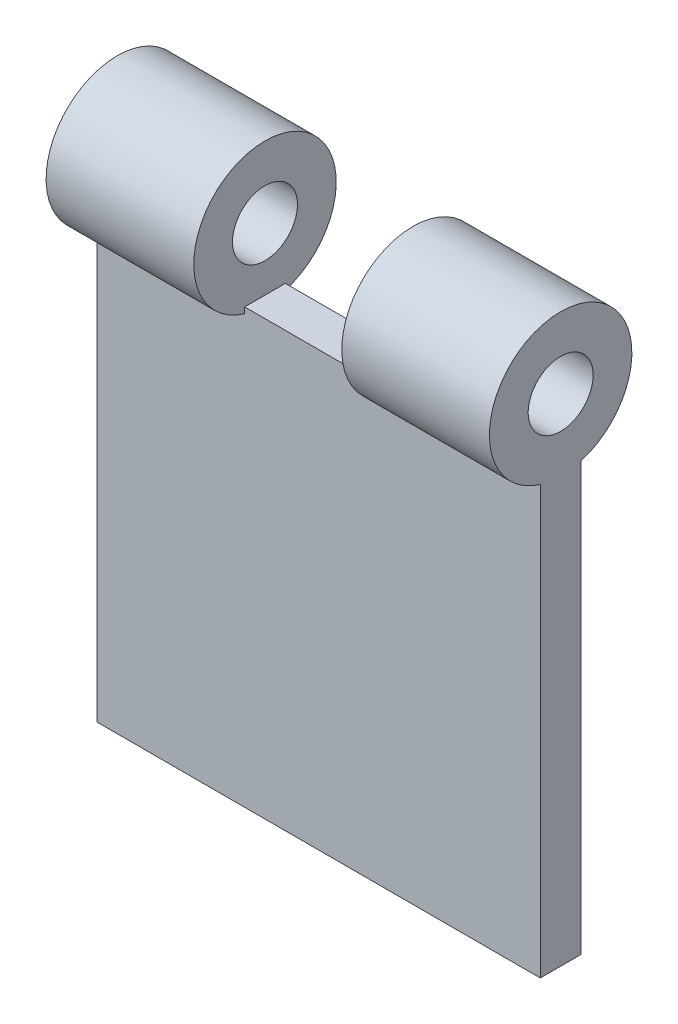
ISO-10303-21;
HEADER;
FILE_DESCRIPTION(('STEP AP214'),'2;1');
FILE_NAME('part.step','',(''),(''),'','','');
FILE_SCHEMA(('AUTOMOTIVE_DESIGN { 1 0 10303 214 1 1 1 1 }'));
ENDSEC;
DATA;
#1=APPLICATION_CONTEXT('core data for automotive mechanical design processes');
#2=APPLICATION_PROTOCOL_DEFINITION('international standard','automotive_design',2000,#1);
#3=PRODUCT_CONTEXT('',#1,'mechanical');
#4=PRODUCT('Part','Part','',(#3));
#5=PRODUCT_RELATED_PRODUCT_CATEGORY('part','',(#4));
#6=PRODUCT_DEFINITION_FORMATION('','',#4);
#7=PRODUCT_DEFINITION_CONTEXT('part definition',#1,'design');
#8=PRODUCT_DEFINITION('design','',#6,#7);
#9=PRODUCT_DEFINITION_SHAPE('','',#8);
#10=(LENGTH_UNIT() NAMED_UNIT(*) SI_UNIT(.MILLI.,.METRE.));
#11=(NAMED_UNIT(*) PLANE_ANGLE_UNIT() SI_UNIT($,.RADIAN.));
#12=(NAMED_UNIT(*) SI_UNIT($,.STERADIAN.) SOLID_ANGLE_UNIT());
#13=UNCERTAINTY_MEASURE_WITH_UNIT(LENGTH_MEASURE(1.E-05),#10,'distance_accuracy_value','');
#14=(GEOMETRIC_REPRESENTATION_CONTEXT(3) GLOBAL_UNCERTAINTY_ASSIGNED_CONTEXT((#13)) GLOBAL_UNIT_ASSIGNED_CONTEXT((#10,
#11,#12)) REPRESENTATION_CONTEXT('',''));
#15=CARTESIAN_POINT('',(0.,0.,0.));
#16=DIRECTION('',(0.,0.,1.));
#17=DIRECTION('',(1.,0.,0.));
#18=AXIS2_PLACEMENT_3D('',#15,#16,#17);
#19=CARTESIAN_POINT('',(-7.67596875,11.09378125,1.143));
#20=DIRECTION('',(1.,0.,0.));
#21=DIRECTION('',(0.,1.,0.));
#22=AXIS2_PLACEMENT_3D('',#19,#20,#21);
#23=CYLINDRICAL_SURFACE('',#22,4.);
#24=DIRECTION('',(-1.,0.,0.));
#25=VECTOR('',#24,1.);
#26=CARTESIAN_POINT('',(24.7226561796803,7.26056445467,2.286));
#27=LINE('',#26,#25);
#28=CARTESIAN_POINT('',(0.614031250000001,7.26056445467,2.286));
#29=VERTEX_POINT('',#28);
#30=CARTESIAN_POINT('',(-7.67596875,7.26056445467,2.28600000000001));
#31=VERTEX_POINT('',#30);
#32=EDGE_CURVE('E148',#29,#31,#27,.T.);
#33=ORIENTED_EDGE('',*,*,#32,.F.);
#34=CARTESIAN_POINT('',(0.614031249999999,11.09378125,1.143));
#35=DIRECTION('',(1.,0.,0.));
#36=DIRECTION('',(0.,1.,0.));
#37=AXIS2_PLACEMENT_3D('',#34,#35,#36);
#38=CIRCLE('',#37,4.);
#39=CARTESIAN_POINT('',(0.614031250000001,7.26056445467,0.));
#40=VERTEX_POINT('',#39);
#41=EDGE_CURVE('E38',#40,#29,#38,.T.);
#42=ORIENTED_EDGE('',*,*,#41,.F.);
#43=DIRECTION('',(-1.,0.,0.));
#44=VECTOR('',#43,1.);
#45=CARTESIAN_POINT('',(24.7226561796803,7.26056445467,0.));
#46=LINE('',#45,#44);
#47=CARTESIAN_POINT('',(-7.67596874999999,7.26056445467,0.));
#48=VERTEX_POINT('',#47);
#49=EDGE_CURVE('E145',#40,#48,#46,.T.);
#50=ORIENTED_EDGE('',*,*,#49,.T.);
#51=CARTESIAN_POINT('',(-7.67596875,11.09378125,1.143));
#52=DIRECTION('',(1.,0.,0.));
#53=DIRECTION('',(0.,1.,0.));
#54=AXIS2_PLACEMENT_3D('',#51,#52,#53);
#55=CIRCLE('',#54,4.);
#56=EDGE_CURVE('E11',#48,#31,#55,.T.);
#57=ORIENTED_EDGE('',*,*,#56,.T.);
#58=EDGE_LOOP('',(#33,#42,#50,#57));
#59=FACE_BOUND('',#58,.T.);
#60=ADVANCED_FACE('F35',(#59),#23,.T.);
#61=CARTESIAN_POINT('',(-7.67596875,11.09378125,1.143));
#62=DIRECTION('',(1.,0.,0.));
#63=DIRECTION('',(0.,1.,0.));
#64=AXIS2_PLACEMENT_3D('',#61,#62,#63);
#65=PLANE('',#64);
#66=CARTESIAN_POINT('',(-7.67596875,11.09378125,1.143));
#67=DIRECTION('',(1.,0.,0.));
#68=DIRECTION('',(0.,1.,0.));
#69=AXIS2_PLACEMENT_3D('',#66,#67,#68);
#70=CIRCLE('',#69,1.825);
#71=CARTESIAN_POINT('',(-7.67596875,12.91878125,1.143));
#72=VERTEX_POINT('',#71);
#73=EDGE_CURVE('E156',#72,#72,#70,.T.);
#74=ORIENTED_EDGE('',*,*,#73,.T.);
#75=EDGE_LOOP('',(#74));
#76=FACE_BOUND('',#75,.T.);
#77=DIRECTION('',(0.,0.,1.));
#78=VECTOR('',#77,1.);
#79=CARTESIAN_POINT('',(-7.67596875,7.59378125,1.143));
#80=LINE('',#79,#78);
#81=CARTESIAN_POINT('',(-7.67596875,7.59378125,0.));
#82=VERTEX_POINT('',#81);
#83=CARTESIAN_POINT('',(-7.67596875,7.59378125,2.286));
#84=VERTEX_POINT('',#83);
#85=EDGE_CURVE('E49',#82,#84,#80,.T.);
#86=ORIENTED_EDGE('',*,*,#85,.T.);
#87=DIRECTION('',(0.,-1.,0.));
#88=VECTOR('',#87,1.);
#89=CARTESIAN_POINT('',(-7.67596875,11.09378125,2.286));
#90=LINE('',#89,#88);
#91=EDGE_CURVE('E128',#84,#31,#90,.T.);
#92=ORIENTED_EDGE('',*,*,#91,.T.);
#93=ORIENTED_EDGE('',*,*,#56,.F.);
#94=DIRECTION('',(0.,-1.,0.));
#95=VECTOR('',#94,1.);
#96=CARTESIAN_POINT('',(-7.67596875,11.09378125,0.));
#97=LINE('',#96,#95);
#98=EDGE_CURVE('E54',#82,#48,#97,.T.);
#99=ORIENTED_EDGE('',*,*,#98,.F.);
#100=EDGE_LOOP('',(#86,#92,#93,#99));
#101=FACE_BOUND('',#100,.T.);
#102=ADVANCED_FACE('F166',(#76,#101),#65,.F.);
#103=CARTESIAN_POINT('',(0.614031249999999,11.09378125,1.143));
#104=DIRECTION('',(1.,0.,0.));
#105=DIRECTION('',(0.,1.,0.));
#106=AXIS2_PLACEMENT_3D('',#103,#104,#105);
#107=PLANE('',#106);
#108=ORIENTED_EDGE('',*,*,#41,.T.);
#109=DIRECTION('',(0.,1.,0.));
#110=VECTOR('',#109,1.);
#111=CARTESIAN_POINT('',(0.614031250000001,7.26056445467,2.286));
#112=LINE('',#111,#110);
#113=CARTESIAN_POINT('',(0.614031250000011,-16.73943554533,2.286));
#114=VERTEX_POINT('',#113);
#115=EDGE_CURVE('E146',#114,#29,#112,.T.);
#116=ORIENTED_EDGE('',*,*,#115,.F.);
#117=DIRECTION('',(0.,0.,1.));
#118=VECTOR('',#117,1.);
#119=CARTESIAN_POINT('',(0.614031250000004,-16.73943554533,0.));
#120=LINE('',#119,#118);
#121=CARTESIAN_POINT('',(0.614031250000004,-16.73943554533,0.));
#122=VERTEX_POINT('',#121);
#123=EDGE_CURVE('E134',#122,#114,#120,.T.);
#124=ORIENTED_EDGE('',*,*,#123,.F.);
#125=DIRECTION('',(0.,-1.,0.));
#126=VECTOR('',#125,1.);
#127=CARTESIAN_POINT('',(0.614031250000001,7.26056445467,0.));
#128=LINE('',#127,#126);
#129=EDGE_CURVE('E142',#40,#122,#128,.T.);
#130=ORIENTED_EDGE('',*,*,#129,.F.);
#131=EDGE_LOOP('',(#108,#116,#124,#130));
#132=FACE_BOUND('',#131,.T.);
#133=CARTESIAN_POINT('',(0.614031249999999,11.09378125,1.143));
#134=DIRECTION('',(1.,0.,0.));
#135=DIRECTION('',(0.,1.,0.));
#136=AXIS2_PLACEMENT_3D('',#133,#134,#135);
#137=CIRCLE('',#136,1.825);
#138=CARTESIAN_POINT('',(0.614031249999999,12.91878125,1.143));
#139=VERTEX_POINT('',#138);
#140=EDGE_CURVE('E155',#139,#139,#137,.T.);
#141=ORIENTED_EDGE('',*,*,#140,.F.);
#142=EDGE_LOOP('',(#141));
#143=FACE_BOUND('',#142,.T.);
#144=ADVANCED_FACE('F164',(#132,#143),#107,.T.);
#145=CARTESIAN_POINT('',(-7.67596875,11.09378125,1.143));
#146=DIRECTION('',(1.,0.,0.));
#147=DIRECTION('',(0.,1.,0.));
#148=AXIS2_PLACEMENT_3D('',#145,#146,#147);
#149=CYLINDRICAL_SURFACE('',#148,1.825);
#150=ORIENTED_EDGE('',*,*,#73,.F.);
#151=EDGE_LOOP('',(#150));
#152=FACE_BOUND('',#151,.T.);
#153=ORIENTED_EDGE('',*,*,#140,.T.);
#154=EDGE_LOOP('',(#153));
#155=FACE_BOUND('',#154,.T.);
#156=ADVANCED_FACE('F162',(#152,#155),#149,.F.);
#157=CARTESIAN_POINT('',(-24.27796875,0.,0.));
#158=DIRECTION('',(-1.,0.,0.));
#159=DIRECTION('',(0.,0.,1.));
#160=AXIS2_PLACEMENT_3D('',#157,#158,#159);
#161=PLANE('',#160);
#162=DIRECTION('',(0.,-1.,0.));
#163=VECTOR('',#162,1.);
#164=CARTESIAN_POINT('',(-24.27796875,7.26056445467,0.));
#165=LINE('',#164,#163);
#166=CARTESIAN_POINT('',(-24.27796875,7.26056445467,0.));
#167=VERTEX_POINT('',#166);
#168=CARTESIAN_POINT('',(-24.27796875,-16.73943554533,0.));
#169=VERTEX_POINT('',#168);
#170=EDGE_CURVE('E131',#167,#169,#165,.T.);
#171=ORIENTED_EDGE('',*,*,#170,.T.);
#172=DIRECTION('',(0.,0.,1.));
#173=VECTOR('',#172,1.);
#174=CARTESIAN_POINT('',(-24.27796875,-16.73943554533,0.));
#175=LINE('',#174,#173);
#176=CARTESIAN_POINT('',(-24.27796875,-16.73943554533,2.286));
#177=VERTEX_POINT('',#176);
#178=EDGE_CURVE('E135',#169,#177,#175,.T.);
#179=ORIENTED_EDGE('',*,*,#178,.T.);
#180=DIRECTION('',(0.,1.,0.));
#181=VECTOR('',#180,1.);
#182=CARTESIAN_POINT('',(-24.27796875,7.26056445467,2.286));
#183=LINE('',#182,#181);
#184=CARTESIAN_POINT('',(-24.27796875,7.26056445467,2.286));
#185=VERTEX_POINT('',#184);
#186=EDGE_CURVE('E132',#177,#185,#183,.T.);
#187=ORIENTED_EDGE('',*,*,#186,.T.);
#188=CARTESIAN_POINT('',(-24.27796875,11.09378125,1.143));
#189=DIRECTION('',(-1.,0.,0.));
#190=DIRECTION('',(0.,0.,1.));
#191=AXIS2_PLACEMENT_3D('',#188,#189,#190);
#192=CIRCLE('',#191,4.);
#193=EDGE_CURVE('E195',#185,#167,#192,.T.);
#194=ORIENTED_EDGE('',*,*,#193,.T.);
#195=EDGE_LOOP('',(#171,#179,#187,#194));
#196=FACE_BOUND('',#195,.T.);
#197=CARTESIAN_POINT('',(-24.27796875,11.09378125,1.143));
#198=DIRECTION('',(-1.,0.,0.));
#199=DIRECTION('',(0.,0.,1.));
#200=AXIS2_PLACEMENT_3D('',#197,#198,#199);
#201=CIRCLE('',#200,1.825);
#202=CARTESIAN_POINT('',(-24.27796875,11.09378125,2.968));
#203=VERTEX_POINT('',#202);
#204=EDGE_CURVE('E200',#203,#203,#201,.T.);
#205=ORIENTED_EDGE('',*,*,#204,.F.);
#206=EDGE_LOOP('',(#205));
#207=FACE_BOUND('',#206,.T.);
#208=ADVANCED_FACE('F172',(#196,#207),#161,.T.);
#209=CARTESIAN_POINT('',(24.7226561796803,-16.73943554533,0.));
#210=DIRECTION('',(0.,-1.,0.));
#211=DIRECTION('',(0.,0.,-1.));
#212=AXIS2_PLACEMENT_3D('',#209,#210,#211);
#213=PLANE('',#212);
#214=DIRECTION('',(-1.,0.,0.));
#215=VECTOR('',#214,1.);
#216=CARTESIAN_POINT('',(24.7226561796803,-16.73943554533,0.));
#217=LINE('',#216,#215);
#218=EDGE_CURVE('E144',#122,#169,#217,.T.);
#219=ORIENTED_EDGE('',*,*,#218,.F.);
#220=ORIENTED_EDGE('',*,*,#123,.T.);
#221=DIRECTION('',(-1.,0.,0.));
#222=VECTOR('',#221,1.);
#223=CARTESIAN_POINT('',(24.7226561796803,-16.73943554533,2.286));
#224=LINE('',#223,#222);
#225=EDGE_CURVE('E141',#114,#177,#224,.T.);
#226=ORIENTED_EDGE('',*,*,#225,.T.);
#227=ORIENTED_EDGE('',*,*,#178,.F.);
#228=EDGE_LOOP('',(#219,#220,#226,#227));
#229=FACE_BOUND('',#228,.T.);
#230=ADVANCED_FACE('F214',(#229),#213,.T.);
#231=CARTESIAN_POINT('',(24.7226561796803,7.26056445467,2.286));
#232=DIRECTION('',(0.,0.,1.));
#233=DIRECTION('',(1.,0.,0.));
#234=AXIS2_PLACEMENT_3D('',#231,#232,#233);
#235=PLANE('',#234);
#236=DIRECTION('',(-1.,0.,0.));
#237=VECTOR('',#236,1.);
#238=CARTESIAN_POINT('',(-15.98796875,7.26056445467,2.286));
#239=LINE('',#238,#237);
#240=CARTESIAN_POINT('',(-15.98796875,7.26056445467,2.286));
#241=VERTEX_POINT('',#240);
#242=EDGE_CURVE('E121',#185,#241,#239,.F.);
#243=ORIENTED_EDGE('',*,*,#242,.F.);
#244=ORIENTED_EDGE('',*,*,#186,.F.);
#245=ORIENTED_EDGE('',*,*,#225,.F.);
#246=ORIENTED_EDGE('',*,*,#115,.T.);
#247=ORIENTED_EDGE('',*,*,#32,.T.);
#248=ORIENTED_EDGE('',*,*,#91,.F.);
#249=DIRECTION('',(1.,0.,0.));
#250=VECTOR('',#249,1.);
#251=CARTESIAN_POINT('',(-24.27796875,7.59378125,2.286));
#252=LINE('',#251,#250);
#253=CARTESIAN_POINT('',(-15.98796875,7.59378125,2.286));
#254=VERTEX_POINT('',#253);
#255=EDGE_CURVE('E118',#254,#84,#252,.T.);
#256=ORIENTED_EDGE('',*,*,#255,.F.);
#257=DIRECTION('',(0.,-1.,0.));
#258=VECTOR('',#257,1.);
#259=CARTESIAN_POINT('',(-15.98796875,0.,2.286));
#260=LINE('',#259,#258);
#261=EDGE_CURVE('E105',#254,#241,#260,.T.);
#262=ORIENTED_EDGE('',*,*,#261,.T.);
#263=EDGE_LOOP('',(#243,#244,#245,#246,#247,#248,#256,#262));
#264=FACE_BOUND('',#263,.T.);
#265=ADVANCED_FACE('F190',(#264),#235,.T.);
#266=CARTESIAN_POINT('',(24.7226561796803,7.26056445467,0.));
#267=DIRECTION('',(0.,0.,-1.));
#268=DIRECTION('',(0.,1.,0.));
#269=AXIS2_PLACEMENT_3D('',#266,#267,#268);
#270=PLANE('',#269);
#271=ORIENTED_EDGE('',*,*,#129,.T.);
#272=ORIENTED_EDGE('',*,*,#218,.T.);
#273=ORIENTED_EDGE('',*,*,#170,.F.);
#274=DIRECTION('',(-1.,0.,0.));
#275=VECTOR('',#274,1.);
#276=CARTESIAN_POINT('',(-15.98796875,7.26056445467,0.));
#277=LINE('',#276,#275);
#278=CARTESIAN_POINT('',(-15.98796875,7.26056445467,0.));
#279=VERTEX_POINT('',#278);
#280=EDGE_CURVE('E117',#167,#279,#277,.F.);
#281=ORIENTED_EDGE('',*,*,#280,.T.);
#282=DIRECTION('',(0.,-1.,0.));
#283=VECTOR('',#282,1.);
#284=CARTESIAN_POINT('',(-15.98796875,0.,0.));
#285=LINE('',#284,#283);
#286=CARTESIAN_POINT('',(-15.98796875,7.59378125,0.));
#287=VERTEX_POINT('',#286);
#288=EDGE_CURVE('E102',#287,#279,#285,.T.);
#289=ORIENTED_EDGE('',*,*,#288,.F.);
#290=DIRECTION('',(1.,0.,0.));
#291=VECTOR('',#290,1.);
#292=CARTESIAN_POINT('',(-24.27796875,7.59378125,0.));
#293=LINE('',#292,#291);
#294=EDGE_CURVE('E115',#287,#82,#293,.T.);
#295=ORIENTED_EDGE('',*,*,#294,.T.);
#296=ORIENTED_EDGE('',*,*,#98,.T.);
#297=ORIENTED_EDGE('',*,*,#49,.F.);
#298=EDGE_LOOP('',(#271,#272,#273,#281,#289,#295,#296,#297));
#299=FACE_BOUND('',#298,.T.);
#300=ADVANCED_FACE('F114',(#299),#270,.T.);
#301=CARTESIAN_POINT('',(-24.27796875,7.59378125,2.286));
#302=DIRECTION('',(0.,1.,0.));
#303=DIRECTION('',(-1.,0.,0.));
#304=AXIS2_PLACEMENT_3D('',#301,#302,#303);
#305=PLANE('',#304);
#306=ORIENTED_EDGE('',*,*,#85,.F.);
#307=ORIENTED_EDGE('',*,*,#294,.F.);
#308=DIRECTION('',(0.,0.,1.));
#309=VECTOR('',#308,1.);
#310=CARTESIAN_POINT('',(-15.98796875,7.59378125,2.286));
#311=LINE('',#310,#309);
#312=EDGE_CURVE('E98',#287,#254,#311,.T.);
#313=ORIENTED_EDGE('',*,*,#312,.T.);
#314=ORIENTED_EDGE('',*,*,#255,.T.);
#315=EDGE_LOOP('',(#306,#307,#313,#314));
#316=FACE_BOUND('',#315,.T.);
#317=ADVANCED_FACE('F120',(#316),#305,.T.);
#318=CARTESIAN_POINT('',(-15.98796875,11.09378125,1.143));
#319=DIRECTION('',(-1.,0.,0.));
#320=DIRECTION('',(0.,0.,1.));
#321=AXIS2_PLACEMENT_3D('',#318,#319,#320);
#322=CYLINDRICAL_SURFACE('',#321,4.);
#323=ORIENTED_EDGE('',*,*,#193,.F.);
#324=ORIENTED_EDGE('',*,*,#242,.T.);
#325=CARTESIAN_POINT('',(-15.98796875,11.09378125,1.143));
#326=DIRECTION('',(-1.,0.,0.));
#327=DIRECTION('',(0.,0.,1.));
#328=AXIS2_PLACEMENT_3D('',#325,#326,#327);
#329=CIRCLE('',#328,4.);
#330=EDGE_CURVE('E110',#241,#279,#329,.T.);
#331=ORIENTED_EDGE('',*,*,#330,.T.);
#332=ORIENTED_EDGE('',*,*,#280,.F.);
#333=EDGE_LOOP('',(#323,#324,#331,#332));
#334=FACE_BOUND('',#333,.T.);
#335=ADVANCED_FACE('F242',(#334),#322,.T.);
#336=CARTESIAN_POINT('',(-15.98796875,11.09378125,1.143));
#337=DIRECTION('',(-1.,0.,0.));
#338=DIRECTION('',(0.,0.,1.));
#339=AXIS2_PLACEMENT_3D('',#336,#337,#338);
#340=PLANE('',#339);
#341=CARTESIAN_POINT('',(-15.98796875,11.09378125,1.143));
#342=DIRECTION('',(-1.,0.,0.));
#343=DIRECTION('',(0.,0.,1.));
#344=AXIS2_PLACEMENT_3D('',#341,#342,#343);
#345=CIRCLE('',#344,1.825);
#346=CARTESIAN_POINT('',(-15.98796875,11.09378125,2.968));
#347=VERTEX_POINT('',#346);
#348=EDGE_CURVE('E198',#347,#347,#345,.T.);
#349=ORIENTED_EDGE('',*,*,#348,.T.);
#350=EDGE_LOOP('',(#349));
#351=FACE_BOUND('',#350,.T.);
#352=ORIENTED_EDGE('',*,*,#261,.F.);
#353=ORIENTED_EDGE('',*,*,#312,.F.);
#354=ORIENTED_EDGE('',*,*,#288,.T.);
#355=ORIENTED_EDGE('',*,*,#330,.F.);
#356=EDGE_LOOP('',(#352,#353,#354,#355));
#357=FACE_BOUND('',#356,.T.);
#358=ADVANCED_FACE('F100',(#351,#357),#340,.F.);
#359=CARTESIAN_POINT('',(-15.98796875,11.09378125,1.143));
#360=DIRECTION('',(-1.,0.,0.));
#361=DIRECTION('',(0.,0.,1.));
#362=AXIS2_PLACEMENT_3D('',#359,#360,#361);
#363=CYLINDRICAL_SURFACE('',#362,1.825);
#364=ORIENTED_EDGE('',*,*,#348,.F.);
#365=EDGE_LOOP('',(#364));
#366=FACE_BOUND('',#365,.T.);
#367=ORIENTED_EDGE('',*,*,#204,.T.);
#368=EDGE_LOOP('',(#367));
#369=FACE_BOUND('',#368,.T.);
#370=ADVANCED_FACE('F207',(#366,#369),#363,.F.);
#371=CLOSED_SHELL('',(#60,#102,#144,#156,#208,#230,#265,#300,#317,#335,#358,#370));
#372=MANIFOLD_SOLID_BREP('B2',#371);
#373=ADVANCED_BREP_SHAPE_REPRESENTATION('',(#18,#372),#14);
#374=SHAPE_DEFINITION_REPRESENTATION(#9,#373);
ENDSEC;
END-ISO-10303-21;
